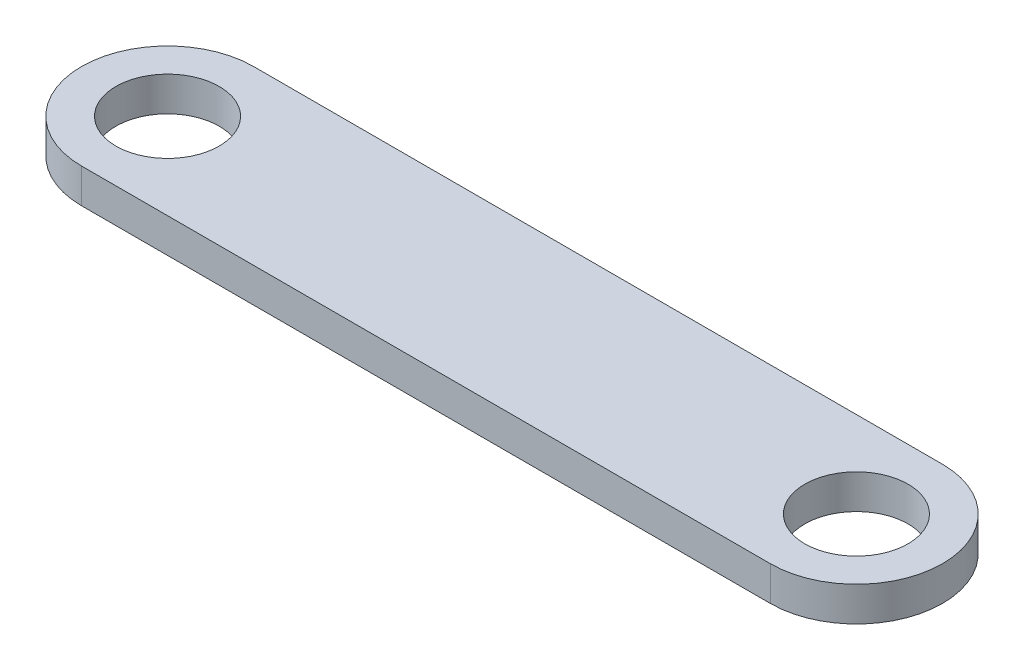
ISO-10303-21;
HEADER;
FILE_DESCRIPTION(('STEP AP214'),'2;1');
FILE_NAME('part.step','',(''),(''),'','','');
FILE_SCHEMA(('AUTOMOTIVE_DESIGN { 1 0 10303 214 1 1 1 1 }'));
ENDSEC;
DATA;
#1=APPLICATION_CONTEXT('core data for automotive mechanical design processes');
#2=APPLICATION_PROTOCOL_DEFINITION('international standard','automotive_design',2000,#1);
#3=PRODUCT_CONTEXT('',#1,'mechanical');
#4=PRODUCT('Part','Part','',(#3));
#5=PRODUCT_RELATED_PRODUCT_CATEGORY('part','',(#4));
#6=PRODUCT_DEFINITION_FORMATION('','',#4);
#7=PRODUCT_DEFINITION_CONTEXT('part definition',#1,'design');
#8=PRODUCT_DEFINITION('design','',#6,#7);
#9=PRODUCT_DEFINITION_SHAPE('','',#8);
#10=(LENGTH_UNIT() NAMED_UNIT(*) SI_UNIT(.MILLI.,.METRE.));
#11=(NAMED_UNIT(*) PLANE_ANGLE_UNIT() SI_UNIT($,.RADIAN.));
#12=(NAMED_UNIT(*) SI_UNIT($,.STERADIAN.) SOLID_ANGLE_UNIT());
#13=UNCERTAINTY_MEASURE_WITH_UNIT(LENGTH_MEASURE(1.E-05),#10,'distance_accuracy_value','');
#14=(GEOMETRIC_REPRESENTATION_CONTEXT(3) GLOBAL_UNCERTAINTY_ASSIGNED_CONTEXT((#13)) GLOBAL_UNIT_ASSIGNED_CONTEXT((#10,
#11,#12)) REPRESENTATION_CONTEXT('',''));
#15=CARTESIAN_POINT('',(0.,0.,0.));
#16=DIRECTION('',(0.,0.,1.));
#17=DIRECTION('',(1.,0.,0.));
#18=AXIS2_PLACEMENT_3D('',#15,#16,#17);
#19=CARTESIAN_POINT('',(0.,4.,0.));
#20=DIRECTION('',(0.,1.,0.));
#21=DIRECTION('',(0.,0.,1.));
#22=AXIS2_PLACEMENT_3D('',#19,#20,#21);
#23=PLANE('',#22);
#24=CARTESIAN_POINT('',(0.,4.,0.));
#25=DIRECTION('',(0.,1.,0.));
#26=DIRECTION('',(0.,0.,1.));
#27=AXIS2_PLACEMENT_3D('',#24,#25,#26);
#28=CIRCLE('',#27,6.);
#29=CARTESIAN_POINT('',(0.,4.,6.));
#30=VERTEX_POINT('',#29);
#31=EDGE_CURVE('E99',#30,#30,#28,.T.);
#32=ORIENTED_EDGE('',*,*,#31,.F.);
#33=EDGE_LOOP('',(#32));
#34=FACE_BOUND('',#33,.T.);
#35=CARTESIAN_POINT('',(0.,4.,0.));
#36=DIRECTION('',(0.,1.,0.));
#37=DIRECTION('',(0.,0.,1.));
#38=AXIS2_PLACEMENT_3D('',#35,#36,#37);
#39=CIRCLE('',#38,10.);
#40=CARTESIAN_POINT('',(0.,4.,-10.));
#41=VERTEX_POINT('',#40);
#42=CARTESIAN_POINT('',(0.,4.,10.));
#43=VERTEX_POINT('',#42);
#44=EDGE_CURVE('E84',#41,#43,#39,.T.);
#45=ORIENTED_EDGE('',*,*,#44,.T.);
#46=DIRECTION('',(1.,0.,0.));
#47=VECTOR('',#46,1.);
#48=CARTESIAN_POINT('',(0.,4.,10.));
#49=LINE('',#48,#47);
#50=CARTESIAN_POINT('',(80.,4.,10.));
#51=VERTEX_POINT('',#50);
#52=EDGE_CURVE('E79',#43,#51,#49,.T.);
#53=ORIENTED_EDGE('',*,*,#52,.T.);
#54=CARTESIAN_POINT('',(80.,4.,0.));
#55=DIRECTION('',(0.,1.,0.));
#56=DIRECTION('',(0.,0.,1.));
#57=AXIS2_PLACEMENT_3D('',#54,#55,#56);
#58=CIRCLE('',#57,10.);
#59=CARTESIAN_POINT('',(80.,4.,-10.));
#60=VERTEX_POINT('',#59);
#61=EDGE_CURVE('E82',#51,#60,#58,.T.);
#62=ORIENTED_EDGE('',*,*,#61,.T.);
#63=DIRECTION('',(-1.,0.,0.));
#64=VECTOR('',#63,1.);
#65=CARTESIAN_POINT('',(0.,4.,-10.));
#66=LINE('',#65,#64);
#67=EDGE_CURVE('E49',#60,#41,#66,.T.);
#68=ORIENTED_EDGE('',*,*,#67,.T.);
#69=EDGE_LOOP('',(#45,#53,#62,#68));
#70=FACE_BOUND('',#69,.T.);
#71=CARTESIAN_POINT('',(80.,4.,0.));
#72=DIRECTION('',(0.,1.,0.));
#73=DIRECTION('',(0.,0.,1.));
#74=AXIS2_PLACEMENT_3D('',#71,#72,#73);
#75=CIRCLE('',#74,6.);
#76=CARTESIAN_POINT('',(80.,4.,6.));
#77=VERTEX_POINT('',#76);
#78=EDGE_CURVE('E114',#77,#77,#75,.T.);
#79=ORIENTED_EDGE('',*,*,#78,.F.);
#80=EDGE_LOOP('',(#79));
#81=FACE_BOUND('',#80,.T.);
#82=ADVANCED_FACE('F32',(#34,#70,#81),#23,.T.);
#83=CARTESIAN_POINT('',(0.,0.,0.));
#84=DIRECTION('',(0.,1.,0.));
#85=DIRECTION('',(0.,0.,1.));
#86=AXIS2_PLACEMENT_3D('',#83,#84,#85);
#87=PLANE('',#86);
#88=CARTESIAN_POINT('',(0.,0.,0.));
#89=DIRECTION('',(0.,1.,0.));
#90=DIRECTION('',(0.,0.,1.));
#91=AXIS2_PLACEMENT_3D('',#88,#89,#90);
#92=CIRCLE('',#91,10.);
#93=CARTESIAN_POINT('',(0.,0.,-10.));
#94=VERTEX_POINT('',#93);
#95=CARTESIAN_POINT('',(0.,0.,10.));
#96=VERTEX_POINT('',#95);
#97=EDGE_CURVE('E96',#94,#96,#92,.T.);
#98=ORIENTED_EDGE('',*,*,#97,.F.);
#99=DIRECTION('',(-1.,0.,0.));
#100=VECTOR('',#99,1.);
#101=CARTESIAN_POINT('',(0.,0.,-10.));
#102=LINE('',#101,#100);
#103=CARTESIAN_POINT('',(80.,0.,-10.));
#104=VERTEX_POINT('',#103);
#105=EDGE_CURVE('E72',#104,#94,#102,.T.);
#106=ORIENTED_EDGE('',*,*,#105,.F.);
#107=CARTESIAN_POINT('',(80.,0.,0.));
#108=DIRECTION('',(0.,1.,0.));
#109=DIRECTION('',(0.,0.,1.));
#110=AXIS2_PLACEMENT_3D('',#107,#108,#109);
#111=CIRCLE('',#110,10.);
#112=CARTESIAN_POINT('',(80.,0.,10.));
#113=VERTEX_POINT('',#112);
#114=EDGE_CURVE('E66',#113,#104,#111,.T.);
#115=ORIENTED_EDGE('',*,*,#114,.F.);
#116=DIRECTION('',(1.,0.,0.));
#117=VECTOR('',#116,1.);
#118=CARTESIAN_POINT('',(0.,0.,10.));
#119=LINE('',#118,#117);
#120=EDGE_CURVE('E88',#96,#113,#119,.T.);
#121=ORIENTED_EDGE('',*,*,#120,.F.);
#122=EDGE_LOOP('',(#98,#106,#115,#121));
#123=FACE_BOUND('',#122,.T.);
#124=CARTESIAN_POINT('',(0.,0.,0.));
#125=DIRECTION('',(0.,1.,0.));
#126=DIRECTION('',(0.,0.,1.));
#127=AXIS2_PLACEMENT_3D('',#124,#125,#126);
#128=CIRCLE('',#127,6.);
#129=CARTESIAN_POINT('',(0.,0.,6.));
#130=VERTEX_POINT('',#129);
#131=EDGE_CURVE('E111',#130,#130,#128,.T.);
#132=ORIENTED_EDGE('',*,*,#131,.T.);
#133=EDGE_LOOP('',(#132));
#134=FACE_BOUND('',#133,.T.);
#135=CARTESIAN_POINT('',(80.,0.,0.));
#136=DIRECTION('',(0.,1.,0.));
#137=DIRECTION('',(0.,0.,1.));
#138=AXIS2_PLACEMENT_3D('',#135,#136,#137);
#139=CIRCLE('',#138,6.);
#140=CARTESIAN_POINT('',(80.,0.,6.));
#141=VERTEX_POINT('',#140);
#142=EDGE_CURVE('E117',#141,#141,#139,.T.);
#143=ORIENTED_EDGE('',*,*,#142,.T.);
#144=EDGE_LOOP('',(#143));
#145=FACE_BOUND('',#144,.T.);
#146=ADVANCED_FACE('F107',(#123,#134,#145),#87,.F.);
#147=CARTESIAN_POINT('',(0.,4.,0.));
#148=DIRECTION('',(0.,-1.,0.));
#149=DIRECTION('',(0.,0.,-1.));
#150=AXIS2_PLACEMENT_3D('',#147,#148,#149);
#151=CYLINDRICAL_SURFACE('',#150,10.);
#152=ORIENTED_EDGE('',*,*,#97,.T.);
#153=DIRECTION('',(0.,-1.,0.));
#154=VECTOR('',#153,1.);
#155=CARTESIAN_POINT('',(0.,4.,10.));
#156=LINE('',#155,#154);
#157=EDGE_CURVE('E11',#43,#96,#156,.T.);
#158=ORIENTED_EDGE('',*,*,#157,.F.);
#159=ORIENTED_EDGE('',*,*,#44,.F.);
#160=DIRECTION('',(0.,-1.,0.));
#161=VECTOR('',#160,1.);
#162=CARTESIAN_POINT('',(0.,4.,-10.));
#163=LINE('',#162,#161);
#164=EDGE_CURVE('E92',#41,#94,#163,.T.);
#165=ORIENTED_EDGE('',*,*,#164,.T.);
#166=EDGE_LOOP('',(#152,#158,#159,#165));
#167=FACE_BOUND('',#166,.T.);
#168=ADVANCED_FACE('F34',(#167),#151,.T.);
#169=CARTESIAN_POINT('',(0.,4.,10.));
#170=DIRECTION('',(0.,0.,-1.));
#171=DIRECTION('',(-1.,0.,0.));
#172=AXIS2_PLACEMENT_3D('',#169,#170,#171);
#173=PLANE('',#172);
#174=ORIENTED_EDGE('',*,*,#120,.T.);
#175=DIRECTION('',(0.,-1.,0.));
#176=VECTOR('',#175,1.);
#177=CARTESIAN_POINT('',(80.,4.,10.));
#178=LINE('',#177,#176);
#179=EDGE_CURVE('E41',#51,#113,#178,.T.);
#180=ORIENTED_EDGE('',*,*,#179,.F.);
#181=ORIENTED_EDGE('',*,*,#52,.F.);
#182=ORIENTED_EDGE('',*,*,#157,.T.);
#183=EDGE_LOOP('',(#174,#180,#181,#182));
#184=FACE_BOUND('',#183,.T.);
#185=ADVANCED_FACE('F87',(#184),#173,.F.);
#186=CARTESIAN_POINT('',(80.,4.,0.));
#187=DIRECTION('',(0.,-1.,0.));
#188=DIRECTION('',(0.,0.,-1.));
#189=AXIS2_PLACEMENT_3D('',#186,#187,#188);
#190=CYLINDRICAL_SURFACE('',#189,10.);
#191=ORIENTED_EDGE('',*,*,#114,.T.);
#192=DIRECTION('',(0.,-1.,0.));
#193=VECTOR('',#192,1.);
#194=CARTESIAN_POINT('',(80.,4.,-10.));
#195=LINE('',#194,#193);
#196=EDGE_CURVE('E89',#60,#104,#195,.T.);
#197=ORIENTED_EDGE('',*,*,#196,.F.);
#198=ORIENTED_EDGE('',*,*,#61,.F.);
#199=ORIENTED_EDGE('',*,*,#179,.T.);
#200=EDGE_LOOP('',(#191,#197,#198,#199));
#201=FACE_BOUND('',#200,.T.);
#202=ADVANCED_FACE('F90',(#201),#190,.T.);
#203=CARTESIAN_POINT('',(0.,4.,-10.));
#204=DIRECTION('',(0.,0.,1.));
#205=DIRECTION('',(1.,0.,0.));
#206=AXIS2_PLACEMENT_3D('',#203,#204,#205);
#207=PLANE('',#206);
#208=ORIENTED_EDGE('',*,*,#105,.T.);
#209=ORIENTED_EDGE('',*,*,#164,.F.);
#210=ORIENTED_EDGE('',*,*,#67,.F.);
#211=ORIENTED_EDGE('',*,*,#196,.T.);
#212=EDGE_LOOP('',(#208,#209,#210,#211));
#213=FACE_BOUND('',#212,.T.);
#214=ADVANCED_FACE('F104',(#213),#207,.F.);
#215=CARTESIAN_POINT('',(0.,4.,0.));
#216=DIRECTION('',(0.,-1.,0.));
#217=DIRECTION('',(0.,0.,-1.));
#218=AXIS2_PLACEMENT_3D('',#215,#216,#217);
#219=CYLINDRICAL_SURFACE('',#218,6.);
#220=ORIENTED_EDGE('',*,*,#31,.T.);
#221=EDGE_LOOP('',(#220));
#222=FACE_BOUND('',#221,.T.);
#223=ORIENTED_EDGE('',*,*,#131,.F.);
#224=EDGE_LOOP('',(#223));
#225=FACE_BOUND('',#224,.T.);
#226=ADVANCED_FACE('F134',(#222,#225),#219,.F.);
#227=CARTESIAN_POINT('',(80.,4.,0.));
#228=DIRECTION('',(0.,-1.,0.));
#229=DIRECTION('',(0.,0.,-1.));
#230=AXIS2_PLACEMENT_3D('',#227,#228,#229);
#231=CYLINDRICAL_SURFACE('',#230,6.);
#232=ORIENTED_EDGE('',*,*,#78,.T.);
#233=EDGE_LOOP('',(#232));
#234=FACE_BOUND('',#233,.T.);
#235=ORIENTED_EDGE('',*,*,#142,.F.);
#236=EDGE_LOOP('',(#235));
#237=FACE_BOUND('',#236,.T.);
#238=ADVANCED_FACE('F123',(#234,#237),#231,.F.);
#239=CLOSED_SHELL('',(#82,#146,#168,#185,#202,#214,#226,#238));
#240=MANIFOLD_SOLID_BREP('B2',#239);
#241=ADVANCED_BREP_SHAPE_REPRESENTATION('',(#18,#240),#14);
#242=SHAPE_DEFINITION_REPRESENTATION(#9,#241);
ENDSEC;
END-ISO-10303-21;
